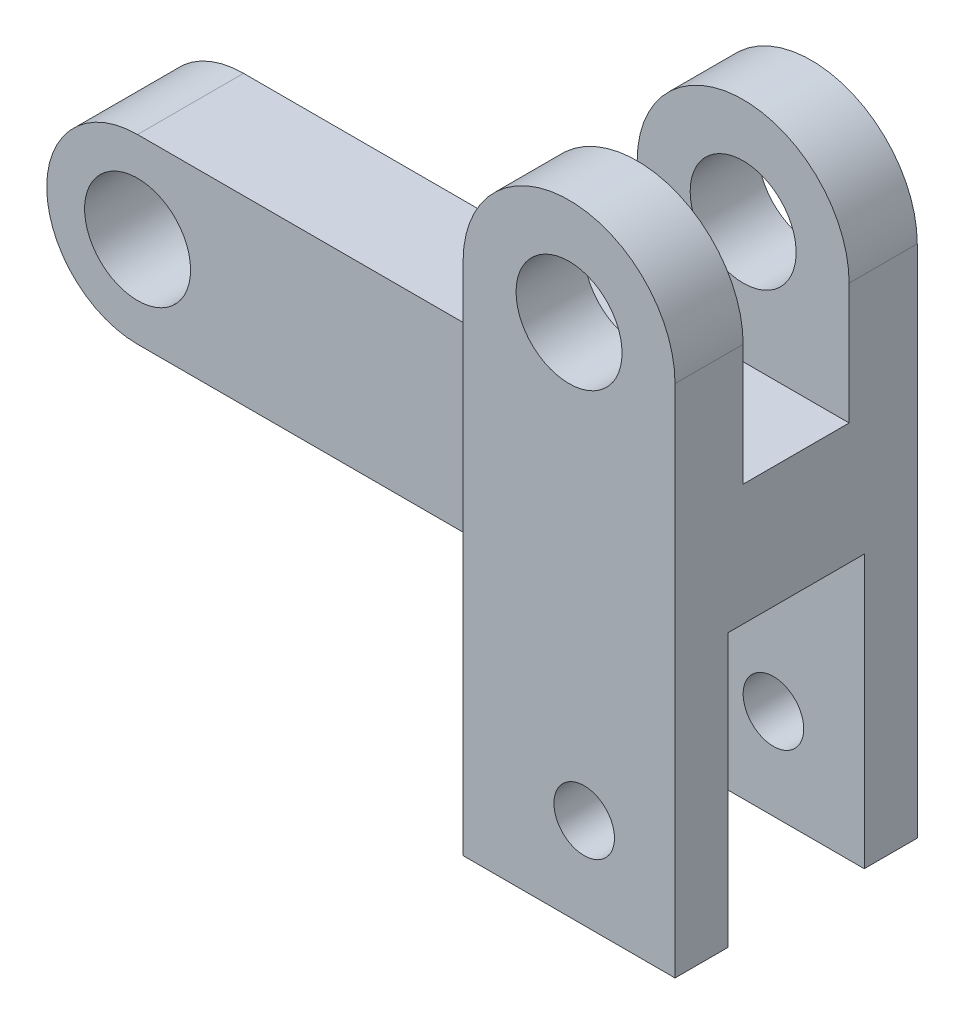
ISO-10303-21;
HEADER;
FILE_DESCRIPTION(('STEP AP214'),'2;1');
FILE_NAME('part.step','',(''),(''),'','','');
FILE_SCHEMA(('AUTOMOTIVE_DESIGN { 1 0 10303 214 1 1 1 1 }'));
ENDSEC;
DATA;
#1=APPLICATION_CONTEXT('core data for automotive mechanical design processes');
#2=APPLICATION_PROTOCOL_DEFINITION('international standard','automotive_design',2000,#1);
#3=PRODUCT_CONTEXT('',#1,'mechanical');
#4=PRODUCT('Part','Part','',(#3));
#5=PRODUCT_RELATED_PRODUCT_CATEGORY('part','',(#4));
#6=PRODUCT_DEFINITION_FORMATION('','',#4);
#7=PRODUCT_DEFINITION_CONTEXT('part definition',#1,'design');
#8=PRODUCT_DEFINITION('design','',#6,#7);
#9=PRODUCT_DEFINITION_SHAPE('','',#8);
#10=(LENGTH_UNIT() NAMED_UNIT(*) SI_UNIT(.MILLI.,.METRE.));
#11=(NAMED_UNIT(*) PLANE_ANGLE_UNIT() SI_UNIT($,.RADIAN.));
#12=(NAMED_UNIT(*) SI_UNIT($,.STERADIAN.) SOLID_ANGLE_UNIT());
#13=UNCERTAINTY_MEASURE_WITH_UNIT(LENGTH_MEASURE(1.E-05),#10,'distance_accuracy_value','');
#14=(GEOMETRIC_REPRESENTATION_CONTEXT(3) GLOBAL_UNCERTAINTY_ASSIGNED_CONTEXT((#13)) GLOBAL_UNIT_ASSIGNED_CONTEXT((#10,
#11,#12)) REPRESENTATION_CONTEXT('',''));
#15=CARTESIAN_POINT('',(0.,0.,0.));
#16=DIRECTION('',(0.,0.,1.));
#17=DIRECTION('',(1.,0.,0.));
#18=AXIS2_PLACEMENT_3D('',#15,#16,#17);
#19=CARTESIAN_POINT('',(0.,2.4,-3.5));
#20=DIRECTION('',(1.,0.,0.));
#21=DIRECTION('',(0.,0.,-1.));
#22=AXIS2_PLACEMENT_3D('',#19,#20,#21);
#23=PLANE('',#22);
#24=DIRECTION('',(0.,-1.,0.));
#25=VECTOR('',#24,1.);
#26=CARTESIAN_POINT('',(0.,2.,2.25));
#27=LINE('',#26,#25);
#28=CARTESIAN_POINT('',(0.,2.,2.25));
#29=VERTEX_POINT('',#28);
#30=CARTESIAN_POINT('',(0.,-7.,2.25));
#31=VERTEX_POINT('',#30);
#32=EDGE_CURVE('E239',#29,#31,#27,.T.);
#33=ORIENTED_EDGE('',*,*,#32,.T.);
#34=DIRECTION('',(0.,0.,-1.));
#35=VECTOR('',#34,1.);
#36=CARTESIAN_POINT('',(0.,-7.,3.5));
#37=LINE('',#36,#35);
#38=CARTESIAN_POINT('',(0.,-7.,4.));
#39=VERTEX_POINT('',#38);
#40=EDGE_CURVE('E278',#39,#31,#37,.T.);
#41=ORIENTED_EDGE('',*,*,#40,.F.);
#42=DIRECTION('',(0.,-1.,0.));
#43=VECTOR('',#42,1.);
#44=CARTESIAN_POINT('',(0.,10.,4.));
#45=LINE('',#44,#43);
#46=CARTESIAN_POINT('',(0.,10.,4.));
#47=VERTEX_POINT('',#46);
#48=EDGE_CURVE('E212',#47,#39,#45,.T.);
#49=ORIENTED_EDGE('',*,*,#48,.F.);
#50=DIRECTION('',(0.,0.,1.));
#51=VECTOR('',#50,1.);
#52=CARTESIAN_POINT('',(0.,10.,1.75));
#53=LINE('',#52,#51);
#54=CARTESIAN_POINT('',(0.,10.,1.75));
#55=VERTEX_POINT('',#54);
#56=EDGE_CURVE('E296',#55,#47,#53,.T.);
#57=ORIENTED_EDGE('',*,*,#56,.F.);
#58=DIRECTION('',(0.,1.,0.));
#59=VECTOR('',#58,1.);
#60=CARTESIAN_POINT('',(0.,0.,1.75));
#61=LINE('',#60,#59);
#62=CARTESIAN_POINT('',(0.,6.,1.75));
#63=VERTEX_POINT('',#62);
#64=EDGE_CURVE('E285',#63,#55,#61,.T.);
#65=ORIENTED_EDGE('',*,*,#64,.F.);
#66=CARTESIAN_POINT('',(0.,2.,1.75));
#67=VERTEX_POINT('',#66);
#68=EDGE_CURVE('E290',#67,#63,#61,.T.);
#69=ORIENTED_EDGE('',*,*,#68,.F.);
#70=DIRECTION('',(0.,0.,1.));
#71=VECTOR('',#70,1.);
#72=CARTESIAN_POINT('',(0.,2.,2.25));
#73=LINE('',#72,#71);
#74=EDGE_CURVE('E221',#67,#29,#73,.T.);
#75=ORIENTED_EDGE('',*,*,#74,.T.);
#76=EDGE_LOOP('',(#33,#41,#49,#57,#65,#69,#75));
#77=FACE_BOUND('',#76,.T.);
#78=ADVANCED_FACE('F45',(#77),#23,.F.);
#79=DIRECTION('',(0.,-1.,0.));
#80=VECTOR('',#79,1.);
#81=CARTESIAN_POINT('',(0.,2.,-2.25));
#82=LINE('',#81,#80);
#83=CARTESIAN_POINT('',(0.,2.,-2.25));
#84=VERTEX_POINT('',#83);
#85=CARTESIAN_POINT('',(0.,-7.,-2.25));
#86=VERTEX_POINT('',#85);
#87=EDGE_CURVE('E228',#84,#86,#82,.T.);
#88=ORIENTED_EDGE('',*,*,#87,.F.);
#89=CARTESIAN_POINT('',(0.,2.,-1.75));
#90=VERTEX_POINT('',#89);
#91=EDGE_CURVE('E216',#84,#90,#73,.T.);
#92=ORIENTED_EDGE('',*,*,#91,.T.);
#93=DIRECTION('',(0.,1.,0.));
#94=VECTOR('',#93,1.);
#95=CARTESIAN_POINT('',(0.,0.,-1.75));
#96=LINE('',#95,#94);
#97=CARTESIAN_POINT('',(0.,6.,-1.75));
#98=VERTEX_POINT('',#97);
#99=EDGE_CURVE('E301',#90,#98,#96,.T.);
#100=ORIENTED_EDGE('',*,*,#99,.T.);
#101=CARTESIAN_POINT('',(0.,10.,-1.75));
#102=VERTEX_POINT('',#101);
#103=EDGE_CURVE('E298',#98,#102,#96,.T.);
#104=ORIENTED_EDGE('',*,*,#103,.T.);
#105=DIRECTION('',(0.,0.,-1.));
#106=VECTOR('',#105,1.);
#107=CARTESIAN_POINT('',(0.,10.,-1.75));
#108=LINE('',#107,#106);
#109=CARTESIAN_POINT('',(0.,10.,-4.));
#110=VERTEX_POINT('',#109);
#111=EDGE_CURVE('E169',#102,#110,#108,.T.);
#112=ORIENTED_EDGE('',*,*,#111,.T.);
#113=DIRECTION('',(0.,1.,0.));
#114=VECTOR('',#113,1.);
#115=CARTESIAN_POINT('',(0.,-7.,-4.));
#116=LINE('',#115,#114);
#117=CARTESIAN_POINT('',(0.,-7.,-4.));
#118=VERTEX_POINT('',#117);
#119=EDGE_CURVE('E187',#118,#110,#116,.T.);
#120=ORIENTED_EDGE('',*,*,#119,.F.);
#121=EDGE_CURVE('E277',#86,#118,#37,.T.);
#122=ORIENTED_EDGE('',*,*,#121,.F.);
#123=EDGE_LOOP('',(#88,#92,#100,#104,#112,#120,#122));
#124=FACE_BOUND('',#123,.T.);
#125=ADVANCED_FACE('F368',(#124),#23,.F.);
#126=CARTESIAN_POINT('',(7.,2.4,-3.5));
#127=DIRECTION('',(-1.,0.,0.));
#128=DIRECTION('',(0.,0.,1.));
#129=AXIS2_PLACEMENT_3D('',#126,#127,#128);
#130=PLANE('',#129);
#131=DIRECTION('',(0.,-1.,0.));
#132=VECTOR('',#131,1.);
#133=CARTESIAN_POINT('',(7.,2.,2.25));
#134=LINE('',#133,#132);
#135=CARTESIAN_POINT('',(7.,2.,2.25));
#136=VERTEX_POINT('',#135);
#137=CARTESIAN_POINT('',(7.,-7.,2.25));
#138=VERTEX_POINT('',#137);
#139=EDGE_CURVE('E237',#136,#138,#134,.T.);
#140=ORIENTED_EDGE('',*,*,#139,.F.);
#141=DIRECTION('',(0.,0.,-1.));
#142=VECTOR('',#141,1.);
#143=CARTESIAN_POINT('',(7.,2.,2.25));
#144=LINE('',#143,#142);
#145=CARTESIAN_POINT('',(7.,2.,-2.25));
#146=VERTEX_POINT('',#145);
#147=EDGE_CURVE('E223',#136,#146,#144,.T.);
#148=ORIENTED_EDGE('',*,*,#147,.T.);
#149=DIRECTION('',(0.,-1.,0.));
#150=VECTOR('',#149,1.);
#151=CARTESIAN_POINT('',(7.,2.,-2.25));
#152=LINE('',#151,#150);
#153=CARTESIAN_POINT('',(7.,-7.,-2.25));
#154=VERTEX_POINT('',#153);
#155=EDGE_CURVE('E235',#146,#154,#152,.T.);
#156=ORIENTED_EDGE('',*,*,#155,.T.);
#157=DIRECTION('',(0.,0.,1.));
#158=VECTOR('',#157,1.);
#159=CARTESIAN_POINT('',(7.,-7.,-3.5));
#160=LINE('',#159,#158);
#161=CARTESIAN_POINT('',(7.,-7.,-4.));
#162=VERTEX_POINT('',#161);
#163=EDGE_CURVE('E177',#162,#154,#160,.T.);
#164=ORIENTED_EDGE('',*,*,#163,.F.);
#165=DIRECTION('',(0.,-1.,0.));
#166=VECTOR('',#165,1.);
#167=CARTESIAN_POINT('',(7.,10.,-4.));
#168=LINE('',#167,#166);
#169=CARTESIAN_POINT('',(7.,10.,-4.));
#170=VERTEX_POINT('',#169);
#171=EDGE_CURVE('E172',#170,#162,#168,.T.);
#172=ORIENTED_EDGE('',*,*,#171,.F.);
#173=DIRECTION('',(0.,0.,-1.));
#174=VECTOR('',#173,1.);
#175=CARTESIAN_POINT('',(7.,10.,-1.75));
#176=LINE('',#175,#174);
#177=CARTESIAN_POINT('',(7.,10.,-1.75));
#178=VERTEX_POINT('',#177);
#179=EDGE_CURVE('E53',#178,#170,#176,.T.);
#180=ORIENTED_EDGE('',*,*,#179,.F.);
#181=DIRECTION('',(0.,-1.,0.));
#182=VECTOR('',#181,1.);
#183=CARTESIAN_POINT('',(7.,0.,-1.75));
#184=LINE('',#183,#182);
#185=CARTESIAN_POINT('',(7.,6.,-1.75));
#186=VERTEX_POINT('',#185);
#187=EDGE_CURVE('E303',#178,#186,#184,.T.);
#188=ORIENTED_EDGE('',*,*,#187,.T.);
#189=DIRECTION('',(0.,0.,-1.));
#190=VECTOR('',#189,1.);
#191=CARTESIAN_POINT('',(7.,6.,1.75));
#192=LINE('',#191,#190);
#193=CARTESIAN_POINT('',(7.,6.,1.75));
#194=VERTEX_POINT('',#193);
#195=EDGE_CURVE('E269',#194,#186,#192,.T.);
#196=ORIENTED_EDGE('',*,*,#195,.F.);
#197=DIRECTION('',(0.,-1.,0.));
#198=VECTOR('',#197,1.);
#199=CARTESIAN_POINT('',(7.,0.,1.75));
#200=LINE('',#199,#198);
#201=CARTESIAN_POINT('',(7.,10.,1.75));
#202=VERTEX_POINT('',#201);
#203=EDGE_CURVE('E292',#202,#194,#200,.T.);
#204=ORIENTED_EDGE('',*,*,#203,.F.);
#205=DIRECTION('',(0.,0.,1.));
#206=VECTOR('',#205,1.);
#207=CARTESIAN_POINT('',(7.,10.,1.75));
#208=LINE('',#207,#206);
#209=CARTESIAN_POINT('',(7.,10.,4.));
#210=VERTEX_POINT('',#209);
#211=EDGE_CURVE('E294',#202,#210,#208,.T.);
#212=ORIENTED_EDGE('',*,*,#211,.T.);
#213=DIRECTION('',(0.,1.,0.));
#214=VECTOR('',#213,1.);
#215=CARTESIAN_POINT('',(7.,-7.,4.));
#216=LINE('',#215,#214);
#217=CARTESIAN_POINT('',(7.,-7.,4.));
#218=VERTEX_POINT('',#217);
#219=EDGE_CURVE('E206',#218,#210,#216,.T.);
#220=ORIENTED_EDGE('',*,*,#219,.F.);
#221=EDGE_CURVE('E275',#138,#218,#160,.T.);
#222=ORIENTED_EDGE('',*,*,#221,.F.);
#223=EDGE_LOOP('',(#140,#148,#156,#164,#172,#180,#188,#196,#204,#212,#220,#222));
#224=FACE_BOUND('',#223,.T.);
#225=ADVANCED_FACE('F174',(#224),#130,.F.);
#226=CARTESIAN_POINT('',(0.,-7.,0.));
#227=DIRECTION('',(0.,-1.,0.));
#228=DIRECTION('',(0.,0.,-1.));
#229=AXIS2_PLACEMENT_3D('',#226,#227,#228);
#230=PLANE('',#229);
#231=ORIENTED_EDGE('',*,*,#40,.T.);
#232=DIRECTION('',(1.,0.,0.));
#233=VECTOR('',#232,1.);
#234=CARTESIAN_POINT('',(0.,-7.,2.25));
#235=LINE('',#234,#233);
#236=EDGE_CURVE('E215',#31,#138,#235,.T.);
#237=ORIENTED_EDGE('',*,*,#236,.T.);
#238=ORIENTED_EDGE('',*,*,#221,.T.);
#239=DIRECTION('',(1.,0.,0.));
#240=VECTOR('',#239,1.);
#241=CARTESIAN_POINT('',(0.,-7.,4.));
#242=LINE('',#241,#240);
#243=EDGE_CURVE('E203',#39,#218,#242,.T.);
#244=ORIENTED_EDGE('',*,*,#243,.F.);
#245=EDGE_LOOP('',(#231,#237,#238,#244));
#246=FACE_BOUND('',#245,.T.);
#247=ADVANCED_FACE('F330',(#246),#230,.T.);
#248=ORIENTED_EDGE('',*,*,#163,.T.);
#249=DIRECTION('',(-1.,0.,0.));
#250=VECTOR('',#249,1.);
#251=CARTESIAN_POINT('',(0.,-7.,-2.25));
#252=LINE('',#251,#250);
#253=EDGE_CURVE('E231',#154,#86,#252,.T.);
#254=ORIENTED_EDGE('',*,*,#253,.T.);
#255=ORIENTED_EDGE('',*,*,#121,.T.);
#256=DIRECTION('',(-1.,0.,0.));
#257=VECTOR('',#256,1.);
#258=CARTESIAN_POINT('',(7.,-7.,-4.));
#259=LINE('',#258,#257);
#260=EDGE_CURVE('E181',#162,#118,#259,.T.);
#261=ORIENTED_EDGE('',*,*,#260,.F.);
#262=EDGE_LOOP('',(#248,#254,#255,#261));
#263=FACE_BOUND('',#262,.T.);
#264=ADVANCED_FACE('F379',(#263),#230,.T.);
#265=CARTESIAN_POINT('',(4.,-4.,-3.5));
#266=DIRECTION('',(0.,0.,1.));
#267=DIRECTION('',(1.,0.,0.));
#268=AXIS2_PLACEMENT_3D('',#265,#266,#267);
#269=CYLINDRICAL_SURFACE('',#268,1.);
#270=CARTESIAN_POINT('',(4.,-4.,2.25));
#271=DIRECTION('',(0.,0.,-1.));
#272=DIRECTION('',(-1.,0.,0.));
#273=AXIS2_PLACEMENT_3D('',#270,#271,#272);
#274=CIRCLE('',#273,1.);
#275=CARTESIAN_POINT('',(3.,-4.,2.25));
#276=VERTEX_POINT('',#275);
#277=EDGE_CURVE('E48',#276,#276,#274,.T.);
#278=ORIENTED_EDGE('',*,*,#277,.T.);
#279=EDGE_LOOP('',(#278));
#280=FACE_BOUND('',#279,.T.);
#281=CARTESIAN_POINT('',(4.,-4.,4.));
#282=DIRECTION('',(0.,0.,1.));
#283=DIRECTION('',(1.,0.,0.));
#284=AXIS2_PLACEMENT_3D('',#281,#282,#283);
#285=CIRCLE('',#284,1.);
#286=CARTESIAN_POINT('',(5.,-4.,4.));
#287=VERTEX_POINT('',#286);
#288=EDGE_CURVE('E200',#287,#287,#285,.T.);
#289=ORIENTED_EDGE('',*,*,#288,.T.);
#290=EDGE_LOOP('',(#289));
#291=FACE_BOUND('',#290,.T.);
#292=ADVANCED_FACE('F313',(#280,#291),#269,.F.);
#293=CARTESIAN_POINT('',(4.,-4.,-2.25));
#294=DIRECTION('',(0.,0.,1.));
#295=DIRECTION('',(1.,0.,0.));
#296=AXIS2_PLACEMENT_3D('',#293,#294,#295);
#297=CIRCLE('',#296,1.);
#298=CARTESIAN_POINT('',(5.,-4.,-2.25));
#299=VERTEX_POINT('',#298);
#300=EDGE_CURVE('E242',#299,#299,#297,.T.);
#301=ORIENTED_EDGE('',*,*,#300,.T.);
#302=EDGE_LOOP('',(#301));
#303=FACE_BOUND('',#302,.T.);
#304=CARTESIAN_POINT('',(4.,-4.,-4.));
#305=DIRECTION('',(0.,0.,-1.));
#306=DIRECTION('',(-1.,0.,0.));
#307=AXIS2_PLACEMENT_3D('',#304,#305,#306);
#308=CIRCLE('',#307,0.999999999999997);
#309=CARTESIAN_POINT('',(3.,-4.,-4.));
#310=VERTEX_POINT('',#309);
#311=EDGE_CURVE('E188',#310,#310,#308,.T.);
#312=ORIENTED_EDGE('',*,*,#311,.T.);
#313=EDGE_LOOP('',(#312));
#314=FACE_BOUND('',#313,.T.);
#315=ADVANCED_FACE('F387',(#303,#314),#269,.F.);
#316=CARTESIAN_POINT('',(3.5,10.,-1.75));
#317=DIRECTION('',(0.,0.,-1.));
#318=DIRECTION('',(-1.,0.,0.));
#319=AXIS2_PLACEMENT_3D('',#316,#317,#318);
#320=CYLINDRICAL_SURFACE('',#319,3.5);
#321=ORIENTED_EDGE('',*,*,#179,.T.);
#322=CARTESIAN_POINT('',(3.5,10.,-4.));
#323=DIRECTION('',(0.,0.,-1.));
#324=DIRECTION('',(-1.,0.,0.));
#325=AXIS2_PLACEMENT_3D('',#322,#323,#324);
#326=CIRCLE('',#325,3.5);
#327=EDGE_CURVE('E165',#110,#170,#326,.T.);
#328=ORIENTED_EDGE('',*,*,#327,.F.);
#329=ORIENTED_EDGE('',*,*,#111,.F.);
#330=CARTESIAN_POINT('',(3.5,10.,-1.75));
#331=DIRECTION('',(0.,0.,-1.));
#332=DIRECTION('',(-1.,0.,0.));
#333=AXIS2_PLACEMENT_3D('',#330,#331,#332);
#334=CIRCLE('',#333,3.5);
#335=EDGE_CURVE('E167',#102,#178,#334,.T.);
#336=ORIENTED_EDGE('',*,*,#335,.T.);
#337=EDGE_LOOP('',(#321,#328,#329,#336));
#338=FACE_BOUND('',#337,.T.);
#339=ADVANCED_FACE('F162',(#338),#320,.T.);
#340=CARTESIAN_POINT('',(0.,0.,-1.75));
#341=DIRECTION('',(0.,0.,-1.));
#342=DIRECTION('',(-1.,0.,0.));
#343=AXIS2_PLACEMENT_3D('',#340,#341,#342);
#344=PLANE('',#343);
#345=CARTESIAN_POINT('',(3.5,10.,-1.75));
#346=DIRECTION('',(0.,0.,-1.));
#347=DIRECTION('',(-1.,0.,0.));
#348=AXIS2_PLACEMENT_3D('',#345,#346,#347);
#349=CIRCLE('',#348,1.75);
#350=CARTESIAN_POINT('',(1.75,10.,-1.75));
#351=VERTEX_POINT('',#350);
#352=EDGE_CURVE('E282',#351,#351,#349,.T.);
#353=ORIENTED_EDGE('',*,*,#352,.T.);
#354=EDGE_LOOP('',(#353));
#355=FACE_BOUND('',#354,.T.);
#356=ORIENTED_EDGE('',*,*,#103,.F.);
#357=DIRECTION('',(1.,0.,0.));
#358=VECTOR('',#357,1.);
#359=CARTESIAN_POINT('',(0.,6.,-1.75));
#360=LINE('',#359,#358);
#361=EDGE_CURVE('E69',#98,#186,#360,.T.);
#362=ORIENTED_EDGE('',*,*,#361,.T.);
#363=ORIENTED_EDGE('',*,*,#187,.F.);
#364=ORIENTED_EDGE('',*,*,#335,.F.);
#365=EDGE_LOOP('',(#356,#362,#363,#364));
#366=FACE_BOUND('',#365,.T.);
#367=ADVANCED_FACE('F369',(#355,#366),#344,.F.);
#368=CARTESIAN_POINT('',(3.5,10.,1.75));
#369=DIRECTION('',(0.,0.,1.));
#370=DIRECTION('',(1.,0.,0.));
#371=AXIS2_PLACEMENT_3D('',#368,#369,#370);
#372=CYLINDRICAL_SURFACE('',#371,3.5);
#373=ORIENTED_EDGE('',*,*,#56,.T.);
#374=CARTESIAN_POINT('',(3.5,10.,4.));
#375=DIRECTION('',(0.,0.,1.));
#376=DIRECTION('',(1.,0.,0.));
#377=AXIS2_PLACEMENT_3D('',#374,#375,#376);
#378=CIRCLE('',#377,3.5);
#379=EDGE_CURVE('E209',#210,#47,#378,.T.);
#380=ORIENTED_EDGE('',*,*,#379,.F.);
#381=ORIENTED_EDGE('',*,*,#211,.F.);
#382=CARTESIAN_POINT('',(3.5,10.,1.75));
#383=DIRECTION('',(0.,0.,-1.));
#384=DIRECTION('',(-1.,0.,0.));
#385=AXIS2_PLACEMENT_3D('',#382,#383,#384);
#386=CIRCLE('',#385,3.5);
#387=EDGE_CURVE('E289',#55,#202,#386,.T.);
#388=ORIENTED_EDGE('',*,*,#387,.F.);
#389=EDGE_LOOP('',(#373,#380,#381,#388));
#390=FACE_BOUND('',#389,.T.);
#391=ADVANCED_FACE('F340',(#390),#372,.T.);
#392=CARTESIAN_POINT('',(0.,0.,1.75));
#393=DIRECTION('',(0.,0.,-1.));
#394=DIRECTION('',(-1.,0.,0.));
#395=AXIS2_PLACEMENT_3D('',#392,#393,#394);
#396=PLANE('',#395);
#397=DIRECTION('',(1.,0.,0.));
#398=VECTOR('',#397,1.);
#399=CARTESIAN_POINT('',(0.,6.,1.75));
#400=LINE('',#399,#398);
#401=EDGE_CURVE('E12',#63,#194,#400,.T.);
#402=ORIENTED_EDGE('',*,*,#401,.F.);
#403=ORIENTED_EDGE('',*,*,#64,.T.);
#404=ORIENTED_EDGE('',*,*,#387,.T.);
#405=ORIENTED_EDGE('',*,*,#203,.T.);
#406=EDGE_LOOP('',(#402,#403,#404,#405));
#407=FACE_BOUND('',#406,.T.);
#408=CARTESIAN_POINT('',(3.5,10.,1.75));
#409=DIRECTION('',(0.,0.,-1.));
#410=DIRECTION('',(-1.,0.,0.));
#411=AXIS2_PLACEMENT_3D('',#408,#409,#410);
#412=CIRCLE('',#411,1.75);
#413=CARTESIAN_POINT('',(1.75,10.,1.75));
#414=VERTEX_POINT('',#413);
#415=EDGE_CURVE('E281',#414,#414,#412,.T.);
#416=ORIENTED_EDGE('',*,*,#415,.F.);
#417=EDGE_LOOP('',(#416));
#418=FACE_BOUND('',#417,.T.);
#419=ADVANCED_FACE('F345',(#407,#418),#396,.T.);
#420=CARTESIAN_POINT('',(3.5,10.,3.5));
#421=DIRECTION('',(0.,0.,-1.));
#422=DIRECTION('',(-1.,0.,0.));
#423=AXIS2_PLACEMENT_3D('',#420,#421,#422);
#424=CYLINDRICAL_SURFACE('',#423,1.75);
#425=ORIENTED_EDGE('',*,*,#415,.T.);
#426=EDGE_LOOP('',(#425));
#427=FACE_BOUND('',#426,.T.);
#428=CARTESIAN_POINT('',(3.5,10.,4.));
#429=DIRECTION('',(0.,0.,1.));
#430=DIRECTION('',(1.,0.,0.));
#431=AXIS2_PLACEMENT_3D('',#428,#429,#430);
#432=CIRCLE('',#431,1.75);
#433=CARTESIAN_POINT('',(5.25,10.,4.));
#434=VERTEX_POINT('',#433);
#435=EDGE_CURVE('E197',#434,#434,#432,.T.);
#436=ORIENTED_EDGE('',*,*,#435,.T.);
#437=EDGE_LOOP('',(#436));
#438=FACE_BOUND('',#437,.T.);
#439=ADVANCED_FACE('F411',(#427,#438),#424,.F.);
#440=ORIENTED_EDGE('',*,*,#352,.F.);
#441=EDGE_LOOP('',(#440));
#442=FACE_BOUND('',#441,.T.);
#443=CARTESIAN_POINT('',(3.5,10.,-4.));
#444=DIRECTION('',(0.,0.,-1.));
#445=DIRECTION('',(-1.,0.,0.));
#446=AXIS2_PLACEMENT_3D('',#443,#444,#445);
#447=CIRCLE('',#446,1.75);
#448=CARTESIAN_POINT('',(1.75,10.,-4.));
#449=VERTEX_POINT('',#448);
#450=EDGE_CURVE('E191',#449,#449,#447,.T.);
#451=ORIENTED_EDGE('',*,*,#450,.T.);
#452=EDGE_LOOP('',(#451));
#453=FACE_BOUND('',#452,.T.);
#454=ADVANCED_FACE('F413',(#442,#453),#424,.F.);
#455=CARTESIAN_POINT('',(0.,0.,1.75));
#456=DIRECTION('',(0.,1.,0.));
#457=DIRECTION('',(0.,0.,1.));
#458=AXIS2_PLACEMENT_3D('',#455,#456,#457);
#459=PLANE('',#458);
#460=DIRECTION('',(1.,0.,0.));
#461=VECTOR('',#460,1.);
#462=CARTESIAN_POINT('',(0.,0.,-1.75));
#463=LINE('',#462,#461);
#464=CARTESIAN_POINT('',(-13.,0.,-1.75));
#465=VERTEX_POINT('',#464);
#466=CARTESIAN_POINT('',(0.,0.,-1.75));
#467=VERTEX_POINT('',#466);
#468=EDGE_CURVE('E263',#465,#467,#463,.T.);
#469=ORIENTED_EDGE('',*,*,#468,.T.);
#470=DIRECTION('',(0.,0.,1.));
#471=VECTOR('',#470,1.);
#472=CARTESIAN_POINT('',(0.,0.,-3.5));
#473=LINE('',#472,#471);
#474=CARTESIAN_POINT('',(0.,0.,1.75));
#475=VERTEX_POINT('',#474);
#476=EDGE_CURVE('E61',#467,#475,#473,.T.);
#477=ORIENTED_EDGE('',*,*,#476,.T.);
#478=DIRECTION('',(1.,0.,0.));
#479=VECTOR('',#478,1.);
#480=CARTESIAN_POINT('',(0.,0.,1.75));
#481=LINE('',#480,#479);
#482=CARTESIAN_POINT('',(-13.,0.,1.75));
#483=VERTEX_POINT('',#482);
#484=EDGE_CURVE('E250',#483,#475,#481,.T.);
#485=ORIENTED_EDGE('',*,*,#484,.F.);
#486=DIRECTION('',(0.,0.,-1.));
#487=VECTOR('',#486,1.);
#488=CARTESIAN_POINT('',(-13.,0.,1.75));
#489=LINE('',#488,#487);
#490=EDGE_CURVE('E272',#483,#465,#489,.T.);
#491=ORIENTED_EDGE('',*,*,#490,.T.);
#492=EDGE_LOOP('',(#469,#477,#485,#491));
#493=FACE_BOUND('',#492,.T.);
#494=ADVANCED_FACE('F355',(#493),#459,.F.);
#495=CARTESIAN_POINT('',(0.,0.,1.75));
#496=DIRECTION('',(0.,0.,1.));
#497=DIRECTION('',(1.,0.,0.));
#498=AXIS2_PLACEMENT_3D('',#495,#496,#497);
#499=PLANE('',#498);
#500=CARTESIAN_POINT('',(-13.,3.,1.75));
#501=DIRECTION('',(0.,0.,1.));
#502=DIRECTION('',(1.,0.,0.));
#503=AXIS2_PLACEMENT_3D('',#500,#501,#502);
#504=CIRCLE('',#503,1.75);
#505=CARTESIAN_POINT('',(-11.25,3.,1.75));
#506=VERTEX_POINT('',#505);
#507=EDGE_CURVE('E243',#506,#506,#504,.T.);
#508=ORIENTED_EDGE('',*,*,#507,.F.);
#509=EDGE_LOOP('',(#508));
#510=FACE_BOUND('',#509,.T.);
#511=EDGE_CURVE('E286',#475,#67,#61,.T.);
#512=ORIENTED_EDGE('',*,*,#511,.T.);
#513=ORIENTED_EDGE('',*,*,#68,.T.);
#514=DIRECTION('',(1.,0.,0.));
#515=VECTOR('',#514,1.);
#516=CARTESIAN_POINT('',(0.,6.,1.75));
#517=LINE('',#516,#515);
#518=CARTESIAN_POINT('',(-13.,6.,1.75));
#519=VERTEX_POINT('',#518);
#520=EDGE_CURVE('E253',#519,#63,#517,.T.);
#521=ORIENTED_EDGE('',*,*,#520,.F.);
#522=CARTESIAN_POINT('',(-13.,3.,1.75));
#523=DIRECTION('',(0.,0.,1.));
#524=DIRECTION('',(1.,0.,0.));
#525=AXIS2_PLACEMENT_3D('',#522,#523,#524);
#526=CIRCLE('',#525,3.);
#527=EDGE_CURVE('E246',#483,#519,#526,.F.);
#528=ORIENTED_EDGE('',*,*,#527,.F.);
#529=ORIENTED_EDGE('',*,*,#484,.T.);
#530=EDGE_LOOP('',(#512,#513,#521,#528,#529));
#531=FACE_BOUND('',#530,.T.);
#532=ADVANCED_FACE('F349',(#510,#531),#499,.T.);
#533=CARTESIAN_POINT('',(0.,0.,-1.75));
#534=DIRECTION('',(0.,0.,1.));
#535=DIRECTION('',(1.,0.,0.));
#536=AXIS2_PLACEMENT_3D('',#533,#534,#535);
#537=PLANE('',#536);
#538=CARTESIAN_POINT('',(-13.,3.,-1.75));
#539=DIRECTION('',(0.,0.,1.));
#540=DIRECTION('',(1.,0.,0.));
#541=AXIS2_PLACEMENT_3D('',#538,#539,#540);
#542=CIRCLE('',#541,1.75);
#543=CARTESIAN_POINT('',(-11.25,3.,-1.75));
#544=VERTEX_POINT('',#543);
#545=EDGE_CURVE('E257',#544,#544,#542,.T.);
#546=ORIENTED_EDGE('',*,*,#545,.T.);
#547=EDGE_LOOP('',(#546));
#548=FACE_BOUND('',#547,.T.);
#549=CARTESIAN_POINT('',(-13.,6.,-1.75));
#550=VERTEX_POINT('',#549);
#551=EDGE_CURVE('E247',#550,#98,#360,.T.);
#552=ORIENTED_EDGE('',*,*,#551,.T.);
#553=ORIENTED_EDGE('',*,*,#99,.F.);
#554=EDGE_CURVE('E299',#467,#90,#96,.T.);
#555=ORIENTED_EDGE('',*,*,#554,.F.);
#556=ORIENTED_EDGE('',*,*,#468,.F.);
#557=CARTESIAN_POINT('',(-13.,3.,-1.75));
#558=DIRECTION('',(0.,0.,1.));
#559=DIRECTION('',(1.,0.,0.));
#560=AXIS2_PLACEMENT_3D('',#557,#558,#559);
#561=CIRCLE('',#560,3.);
#562=EDGE_CURVE('E260',#465,#550,#561,.F.);
#563=ORIENTED_EDGE('',*,*,#562,.T.);
#564=EDGE_LOOP('',(#552,#553,#555,#556,#563));
#565=FACE_BOUND('',#564,.T.);
#566=ADVANCED_FACE('F359',(#548,#565),#537,.F.);
#567=CARTESIAN_POINT('',(-13.,3.,1.75));
#568=DIRECTION('',(0.,0.,-1.));
#569=DIRECTION('',(-1.,0.,0.));
#570=AXIS2_PLACEMENT_3D('',#567,#568,#569);
#571=CYLINDRICAL_SURFACE('',#570,3.);
#572=ORIENTED_EDGE('',*,*,#562,.F.);
#573=ORIENTED_EDGE('',*,*,#490,.F.);
#574=ORIENTED_EDGE('',*,*,#527,.T.);
#575=DIRECTION('',(0.,0.,-1.));
#576=VECTOR('',#575,1.);
#577=CARTESIAN_POINT('',(-13.,6.,1.75));
#578=LINE('',#577,#576);
#579=EDGE_CURVE('E256',#519,#550,#578,.T.);
#580=ORIENTED_EDGE('',*,*,#579,.T.);
#581=EDGE_LOOP('',(#572,#573,#574,#580));
#582=FACE_BOUND('',#581,.T.);
#583=ADVANCED_FACE('F363',(#582),#571,.T.);
#584=CARTESIAN_POINT('',(-13.,3.,1.75));
#585=DIRECTION('',(0.,0.,-1.));
#586=DIRECTION('',(-1.,0.,0.));
#587=AXIS2_PLACEMENT_3D('',#584,#585,#586);
#588=CYLINDRICAL_SURFACE('',#587,1.75);
#589=ORIENTED_EDGE('',*,*,#507,.T.);
#590=EDGE_LOOP('',(#589));
#591=FACE_BOUND('',#590,.T.);
#592=ORIENTED_EDGE('',*,*,#545,.F.);
#593=EDGE_LOOP('',(#592));
#594=FACE_BOUND('',#593,.T.);
#595=ADVANCED_FACE('F445',(#591,#594),#588,.F.);
#596=CARTESIAN_POINT('',(0.,6.,1.75));
#597=DIRECTION('',(0.,1.,0.));
#598=DIRECTION('',(0.,0.,1.));
#599=AXIS2_PLACEMENT_3D('',#596,#597,#598);
#600=PLANE('',#599);
#601=ORIENTED_EDGE('',*,*,#551,.F.);
#602=ORIENTED_EDGE('',*,*,#579,.F.);
#603=ORIENTED_EDGE('',*,*,#520,.T.);
#604=ORIENTED_EDGE('',*,*,#401,.T.);
#605=ORIENTED_EDGE('',*,*,#195,.T.);
#606=ORIENTED_EDGE('',*,*,#361,.F.);
#607=EDGE_LOOP('',(#601,#602,#603,#604,#605,#606));
#608=FACE_BOUND('',#607,.T.);
#609=ADVANCED_FACE('F365',(#608),#600,.T.);
#610=CARTESIAN_POINT('',(0.,2.,2.25));
#611=DIRECTION('',(1.,0.,0.));
#612=DIRECTION('',(0.,0.,-1.));
#613=AXIS2_PLACEMENT_3D('',#610,#611,#612);
#614=PLANE('',#613);
#615=ORIENTED_EDGE('',*,*,#476,.F.);
#616=ORIENTED_EDGE('',*,*,#554,.T.);
#617=EDGE_CURVE('E220',#90,#67,#73,.T.);
#618=ORIENTED_EDGE('',*,*,#617,.T.);
#619=ORIENTED_EDGE('',*,*,#511,.F.);
#620=EDGE_LOOP('',(#615,#616,#618,#619));
#621=FACE_BOUND('',#620,.T.);
#622=ADVANCED_FACE('F320',(#621),#614,.T.);
#623=CARTESIAN_POINT('',(0.,2.,2.25));
#624=DIRECTION('',(0.,0.,-1.));
#625=DIRECTION('',(-1.,0.,0.));
#626=AXIS2_PLACEMENT_3D('',#623,#624,#625);
#627=PLANE('',#626);
#628=ORIENTED_EDGE('',*,*,#277,.F.);
#629=EDGE_LOOP('',(#628));
#630=FACE_BOUND('',#629,.T.);
#631=ORIENTED_EDGE('',*,*,#236,.F.);
#632=ORIENTED_EDGE('',*,*,#32,.F.);
#633=DIRECTION('',(1.,0.,0.));
#634=VECTOR('',#633,1.);
#635=CARTESIAN_POINT('',(0.,2.,2.25));
#636=LINE('',#635,#634);
#637=EDGE_CURVE('E219',#29,#136,#636,.T.);
#638=ORIENTED_EDGE('',*,*,#637,.T.);
#639=ORIENTED_EDGE('',*,*,#139,.T.);
#640=EDGE_LOOP('',(#631,#632,#638,#639));
#641=FACE_BOUND('',#640,.T.);
#642=ADVANCED_FACE('F316',(#630,#641),#627,.T.);
#643=CARTESIAN_POINT('',(0.,2.,-2.25));
#644=DIRECTION('',(0.,0.,1.));
#645=DIRECTION('',(1.,0.,0.));
#646=AXIS2_PLACEMENT_3D('',#643,#644,#645);
#647=PLANE('',#646);
#648=ORIENTED_EDGE('',*,*,#300,.F.);
#649=EDGE_LOOP('',(#648));
#650=FACE_BOUND('',#649,.T.);
#651=ORIENTED_EDGE('',*,*,#253,.F.);
#652=ORIENTED_EDGE('',*,*,#155,.F.);
#653=DIRECTION('',(-1.,0.,0.));
#654=VECTOR('',#653,1.);
#655=CARTESIAN_POINT('',(0.,2.,-2.25));
#656=LINE('',#655,#654);
#657=EDGE_CURVE('E226',#146,#84,#656,.T.);
#658=ORIENTED_EDGE('',*,*,#657,.T.);
#659=ORIENTED_EDGE('',*,*,#87,.T.);
#660=EDGE_LOOP('',(#651,#652,#658,#659));
#661=FACE_BOUND('',#660,.T.);
#662=ADVANCED_FACE('F319',(#650,#661),#647,.T.);
#663=CARTESIAN_POINT('',(0.,2.,0.));
#664=DIRECTION('',(0.,-1.,0.));
#665=DIRECTION('',(0.,0.,-1.));
#666=AXIS2_PLACEMENT_3D('',#663,#664,#665);
#667=PLANE('',#666);
#668=ORIENTED_EDGE('',*,*,#91,.F.);
#669=ORIENTED_EDGE('',*,*,#657,.F.);
#670=ORIENTED_EDGE('',*,*,#147,.F.);
#671=ORIENTED_EDGE('',*,*,#637,.F.);
#672=ORIENTED_EDGE('',*,*,#74,.F.);
#673=ORIENTED_EDGE('',*,*,#617,.F.);
#674=EDGE_LOOP('',(#668,#669,#670,#671,#672,#673));
#675=FACE_BOUND('',#674,.T.);
#676=ADVANCED_FACE('F375',(#675),#667,.T.);
#677=CARTESIAN_POINT('',(3.5,10.,4.));
#678=DIRECTION('',(0.,0.,1.));
#679=DIRECTION('',(1.,0.,0.));
#680=AXIS2_PLACEMENT_3D('',#677,#678,#679);
#681=PLANE('',#680);
#682=ORIENTED_EDGE('',*,*,#288,.F.);
#683=EDGE_LOOP('',(#682));
#684=FACE_BOUND('',#683,.T.);
#685=ORIENTED_EDGE('',*,*,#243,.T.);
#686=ORIENTED_EDGE('',*,*,#219,.T.);
#687=ORIENTED_EDGE('',*,*,#379,.T.);
#688=ORIENTED_EDGE('',*,*,#48,.T.);
#689=EDGE_LOOP('',(#685,#686,#687,#688));
#690=FACE_BOUND('',#689,.T.);
#691=ORIENTED_EDGE('',*,*,#435,.F.);
#692=EDGE_LOOP('',(#691));
#693=FACE_BOUND('',#692,.T.);
#694=ADVANCED_FACE('F333',(#684,#690,#693),#681,.T.);
#695=CARTESIAN_POINT('',(3.5,10.,-4.));
#696=DIRECTION('',(0.,0.,-1.));
#697=DIRECTION('',(-1.,0.,0.));
#698=AXIS2_PLACEMENT_3D('',#695,#696,#697);
#699=PLANE('',#698);
#700=ORIENTED_EDGE('',*,*,#311,.F.);
#701=EDGE_LOOP('',(#700));
#702=FACE_BOUND('',#701,.T.);
#703=ORIENTED_EDGE('',*,*,#327,.T.);
#704=ORIENTED_EDGE('',*,*,#171,.T.);
#705=ORIENTED_EDGE('',*,*,#260,.T.);
#706=ORIENTED_EDGE('',*,*,#119,.T.);
#707=EDGE_LOOP('',(#703,#704,#705,#706));
#708=FACE_BOUND('',#707,.T.);
#709=ORIENTED_EDGE('',*,*,#450,.F.);
#710=EDGE_LOOP('',(#709));
#711=FACE_BOUND('',#710,.T.);
#712=ADVANCED_FACE('F184',(#702,#708,#711),#699,.T.);
#713=CLOSED_SHELL('',(#78,#125,#225,#247,#264,#292,#315,#339,#367,#391,#419,#439,#454,#494,#532,
#566,#583,#595,#609,#622,#642,#662,#676,#694,#712));
#714=MANIFOLD_SOLID_BREP('B2',#713);
#715=ADVANCED_BREP_SHAPE_REPRESENTATION('',(#18,#714),#14);
#716=SHAPE_DEFINITION_REPRESENTATION(#9,#715);
ENDSEC;
END-ISO-10303-21;
